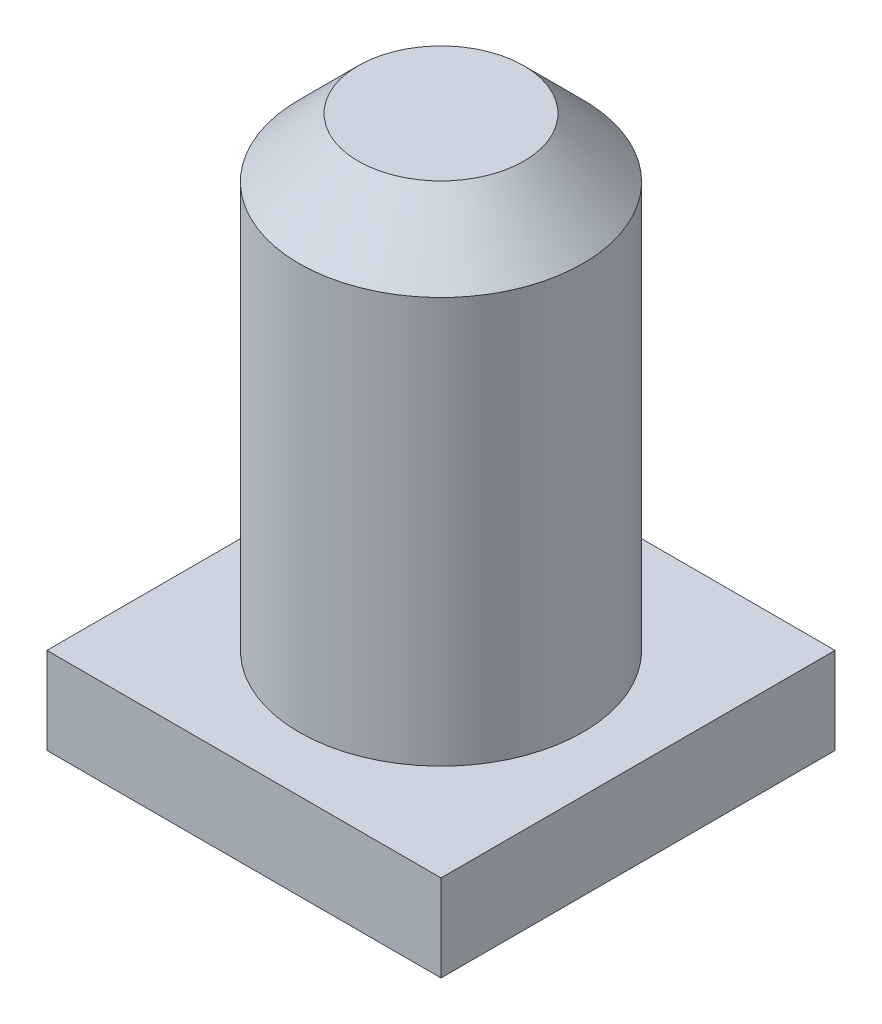
ISO-10303-21;
HEADER;
FILE_DESCRIPTION(('STEP AP214'),'2;1');
FILE_NAME('part.step','',(''),(''),'','','');
FILE_SCHEMA(('AUTOMOTIVE_DESIGN { 1 0 10303 214 1 1 1 1 }'));
ENDSEC;
DATA;
#1=APPLICATION_CONTEXT('core data for automotive mechanical design processes');
#2=APPLICATION_PROTOCOL_DEFINITION('international standard','automotive_design',2000,#1);
#3=PRODUCT_CONTEXT('',#1,'mechanical');
#4=PRODUCT('Part','Part','',(#3));
#5=PRODUCT_RELATED_PRODUCT_CATEGORY('part','',(#4));
#6=PRODUCT_DEFINITION_FORMATION('','',#4);
#7=PRODUCT_DEFINITION_CONTEXT('part definition',#1,'design');
#8=PRODUCT_DEFINITION('design','',#6,#7);
#9=PRODUCT_DEFINITION_SHAPE('','',#8);
#10=(LENGTH_UNIT() NAMED_UNIT(*) SI_UNIT(.MILLI.,.METRE.));
#11=(NAMED_UNIT(*) PLANE_ANGLE_UNIT() SI_UNIT($,.RADIAN.));
#12=(NAMED_UNIT(*) SI_UNIT($,.STERADIAN.) SOLID_ANGLE_UNIT());
#13=UNCERTAINTY_MEASURE_WITH_UNIT(LENGTH_MEASURE(1.E-05),#10,'distance_accuracy_value','');
#14=(GEOMETRIC_REPRESENTATION_CONTEXT(3) GLOBAL_UNCERTAINTY_ASSIGNED_CONTEXT((#13)) GLOBAL_UNIT_ASSIGNED_CONTEXT((#10,
#11,#12)) REPRESENTATION_CONTEXT('',''));
#15=CARTESIAN_POINT('',(0.,0.,0.));
#16=DIRECTION('',(0.,0.,1.));
#17=DIRECTION('',(1.,0.,0.));
#18=AXIS2_PLACEMENT_3D('',#15,#16,#17);
#19=CARTESIAN_POINT('',(0.,7.,0.));
#20=DIRECTION('',(0.,-1.,0.));
#21=DIRECTION('',(0.,0.,-1.));
#22=AXIS2_PLACEMENT_3D('',#19,#20,#21);
#23=CYLINDRICAL_SURFACE('',#22,1.8);
#24=CARTESIAN_POINT('',(0.,6.25,0.));
#25=DIRECTION('',(0.,1.,0.));
#26=DIRECTION('',(0.,0.,1.));
#27=AXIS2_PLACEMENT_3D('',#24,#25,#26);
#28=CIRCLE('',#27,1.8);
#29=CARTESIAN_POINT('',(0.,6.25,1.8));
#30=VERTEX_POINT('',#29);
#31=EDGE_CURVE('E11',#30,#30,#28,.F.);
#32=ORIENTED_EDGE('',*,*,#31,.T.);
#33=EDGE_LOOP('',(#32));
#34=FACE_BOUND('',#33,.T.);
#35=CARTESIAN_POINT('',(0.,1.1,0.));
#36=DIRECTION('',(0.,1.,0.));
#37=DIRECTION('',(0.,0.,1.));
#38=AXIS2_PLACEMENT_3D('',#35,#36,#37);
#39=CIRCLE('',#38,1.8);
#40=CARTESIAN_POINT('',(0.,1.1,1.8));
#41=VERTEX_POINT('',#40);
#42=EDGE_CURVE('E110',#41,#41,#39,.T.);
#43=ORIENTED_EDGE('',*,*,#42,.T.);
#44=EDGE_LOOP('',(#43));
#45=FACE_BOUND('',#44,.T.);
#46=ADVANCED_FACE('F33',(#34,#45),#23,.T.);
#47=CARTESIAN_POINT('',(0.,7.,0.));
#48=DIRECTION('',(0.,1.,0.));
#49=DIRECTION('',(0.,0.,1.));
#50=AXIS2_PLACEMENT_3D('',#47,#48,#49);
#51=PLANE('',#50);
#52=CARTESIAN_POINT('',(0.,7.,0.));
#53=DIRECTION('',(0.,1.,0.));
#54=DIRECTION('',(0.,0.,1.));
#55=AXIS2_PLACEMENT_3D('',#52,#53,#54);
#56=CIRCLE('',#55,1.05);
#57=CARTESIAN_POINT('',(0.,7.,1.05));
#58=VERTEX_POINT('',#57);
#59=EDGE_CURVE('E42',#58,#58,#56,.T.);
#60=ORIENTED_EDGE('',*,*,#59,.T.);
#61=EDGE_LOOP('',(#60));
#62=FACE_BOUND('',#61,.T.);
#63=ADVANCED_FACE('F117',(#62),#51,.T.);
#64=CARTESIAN_POINT('',(2.5,1.1,-2.5));
#65=DIRECTION('',(1.,0.,0.));
#66=DIRECTION('',(0.,0.,-1.));
#67=AXIS2_PLACEMENT_3D('',#64,#65,#66);
#68=PLANE('',#67);
#69=DIRECTION('',(0.,0.,1.));
#70=VECTOR('',#69,1.);
#71=CARTESIAN_POINT('',(2.5,0.,-2.5));
#72=LINE('',#71,#70);
#73=CARTESIAN_POINT('',(2.5,0.,-2.5));
#74=VERTEX_POINT('',#73);
#75=CARTESIAN_POINT('',(2.5,0.,2.5));
#76=VERTEX_POINT('',#75);
#77=EDGE_CURVE('E101',#74,#76,#72,.T.);
#78=ORIENTED_EDGE('',*,*,#77,.F.);
#79=DIRECTION('',(0.,-1.,0.));
#80=VECTOR('',#79,1.);
#81=CARTESIAN_POINT('',(2.5,1.1,-2.5));
#82=LINE('',#81,#80);
#83=CARTESIAN_POINT('',(2.5,1.1,-2.5));
#84=VERTEX_POINT('',#83);
#85=EDGE_CURVE('E50',#84,#74,#82,.T.);
#86=ORIENTED_EDGE('',*,*,#85,.F.);
#87=DIRECTION('',(0.,0.,1.));
#88=VECTOR('',#87,1.);
#89=CARTESIAN_POINT('',(2.5,1.1,-2.5));
#90=LINE('',#89,#88);
#91=CARTESIAN_POINT('',(2.5,1.1,2.5));
#92=VERTEX_POINT('',#91);
#93=EDGE_CURVE('E95',#84,#92,#90,.T.);
#94=ORIENTED_EDGE('',*,*,#93,.T.);
#95=DIRECTION('',(0.,-1.,0.));
#96=VECTOR('',#95,1.);
#97=CARTESIAN_POINT('',(2.5,1.1,2.5));
#98=LINE('',#97,#96);
#99=EDGE_CURVE('E78',#92,#76,#98,.T.);
#100=ORIENTED_EDGE('',*,*,#99,.T.);
#101=EDGE_LOOP('',(#78,#86,#94,#100));
#102=FACE_BOUND('',#101,.T.);
#103=ADVANCED_FACE('F133',(#102),#68,.T.);
#104=CARTESIAN_POINT('',(-2.5,1.1,-2.5));
#105=DIRECTION('',(0.,0.,-1.));
#106=DIRECTION('',(-1.,0.,0.));
#107=AXIS2_PLACEMENT_3D('',#104,#105,#106);
#108=PLANE('',#107);
#109=DIRECTION('',(1.,0.,0.));
#110=VECTOR('',#109,1.);
#111=CARTESIAN_POINT('',(-2.5,0.,-2.5));
#112=LINE('',#111,#110);
#113=CARTESIAN_POINT('',(-2.5,0.,-2.5));
#114=VERTEX_POINT('',#113);
#115=EDGE_CURVE('E97',#114,#74,#112,.T.);
#116=ORIENTED_EDGE('',*,*,#115,.F.);
#117=DIRECTION('',(0.,-1.,0.));
#118=VECTOR('',#117,1.);
#119=CARTESIAN_POINT('',(-2.5,1.1,-2.5));
#120=LINE('',#119,#118);
#121=CARTESIAN_POINT('',(-2.5,1.1,-2.5));
#122=VERTEX_POINT('',#121);
#123=EDGE_CURVE('E67',#122,#114,#120,.T.);
#124=ORIENTED_EDGE('',*,*,#123,.F.);
#125=DIRECTION('',(1.,0.,0.));
#126=VECTOR('',#125,1.);
#127=CARTESIAN_POINT('',(-2.5,1.1,-2.5));
#128=LINE('',#127,#126);
#129=EDGE_CURVE('E92',#122,#84,#128,.T.);
#130=ORIENTED_EDGE('',*,*,#129,.T.);
#131=ORIENTED_EDGE('',*,*,#85,.T.);
#132=EDGE_LOOP('',(#116,#124,#130,#131));
#133=FACE_BOUND('',#132,.T.);
#134=ADVANCED_FACE('F139',(#133),#108,.T.);
#135=CARTESIAN_POINT('',(-2.5,1.1,-2.5));
#136=DIRECTION('',(-1.,0.,0.));
#137=DIRECTION('',(0.,0.,1.));
#138=AXIS2_PLACEMENT_3D('',#135,#136,#137);
#139=PLANE('',#138);
#140=DIRECTION('',(0.,0.,-1.));
#141=VECTOR('',#140,1.);
#142=CARTESIAN_POINT('',(-2.5,0.,-2.5));
#143=LINE('',#142,#141);
#144=CARTESIAN_POINT('',(-2.5,0.,2.5));
#145=VERTEX_POINT('',#144);
#146=EDGE_CURVE('E86',#145,#114,#143,.T.);
#147=ORIENTED_EDGE('',*,*,#146,.F.);
#148=DIRECTION('',(0.,-1.,0.));
#149=VECTOR('',#148,1.);
#150=CARTESIAN_POINT('',(-2.5,1.1,2.5));
#151=LINE('',#150,#149);
#152=CARTESIAN_POINT('',(-2.5,1.1,2.5));
#153=VERTEX_POINT('',#152);
#154=EDGE_CURVE('E81',#153,#145,#151,.T.);
#155=ORIENTED_EDGE('',*,*,#154,.F.);
#156=DIRECTION('',(0.,0.,-1.));
#157=VECTOR('',#156,1.);
#158=CARTESIAN_POINT('',(-2.5,1.1,-2.5));
#159=LINE('',#158,#157);
#160=EDGE_CURVE('E84',#153,#122,#159,.T.);
#161=ORIENTED_EDGE('',*,*,#160,.T.);
#162=ORIENTED_EDGE('',*,*,#123,.T.);
#163=EDGE_LOOP('',(#147,#155,#161,#162));
#164=FACE_BOUND('',#163,.T.);
#165=ADVANCED_FACE('F83',(#164),#139,.T.);
#166=CARTESIAN_POINT('',(-2.5,1.1,2.5));
#167=DIRECTION('',(0.,0.,1.));
#168=DIRECTION('',(1.,0.,0.));
#169=AXIS2_PLACEMENT_3D('',#166,#167,#168);
#170=PLANE('',#169);
#171=DIRECTION('',(-1.,0.,0.));
#172=VECTOR('',#171,1.);
#173=CARTESIAN_POINT('',(-2.5,0.,2.5));
#174=LINE('',#173,#172);
#175=EDGE_CURVE('E104',#76,#145,#174,.T.);
#176=ORIENTED_EDGE('',*,*,#175,.F.);
#177=ORIENTED_EDGE('',*,*,#99,.F.);
#178=DIRECTION('',(-1.,0.,0.));
#179=VECTOR('',#178,1.);
#180=CARTESIAN_POINT('',(-2.5,1.1,2.5));
#181=LINE('',#180,#179);
#182=EDGE_CURVE('E91',#92,#153,#181,.T.);
#183=ORIENTED_EDGE('',*,*,#182,.T.);
#184=ORIENTED_EDGE('',*,*,#154,.T.);
#185=EDGE_LOOP('',(#176,#177,#183,#184));
#186=FACE_BOUND('',#185,.T.);
#187=ADVANCED_FACE('F94',(#186),#170,.T.);
#188=CARTESIAN_POINT('',(0.,1.1,0.));
#189=DIRECTION('',(0.,1.,0.));
#190=DIRECTION('',(0.,0.,1.));
#191=AXIS2_PLACEMENT_3D('',#188,#189,#190);
#192=PLANE('',#191);
#193=ORIENTED_EDGE('',*,*,#42,.F.);
#194=EDGE_LOOP('',(#193));
#195=FACE_BOUND('',#194,.T.);
#196=ORIENTED_EDGE('',*,*,#93,.F.);
#197=ORIENTED_EDGE('',*,*,#129,.F.);
#198=ORIENTED_EDGE('',*,*,#160,.F.);
#199=ORIENTED_EDGE('',*,*,#182,.F.);
#200=EDGE_LOOP('',(#196,#197,#198,#199));
#201=FACE_BOUND('',#200,.T.);
#202=ADVANCED_FACE('F90',(#195,#201),#192,.T.);
#203=CARTESIAN_POINT('',(0.,0.,0.));
#204=DIRECTION('',(0.,1.,0.));
#205=DIRECTION('',(0.,0.,1.));
#206=AXIS2_PLACEMENT_3D('',#203,#204,#205);
#207=PLANE('',#206);
#208=ORIENTED_EDGE('',*,*,#77,.T.);
#209=ORIENTED_EDGE('',*,*,#175,.T.);
#210=ORIENTED_EDGE('',*,*,#146,.T.);
#211=ORIENTED_EDGE('',*,*,#115,.T.);
#212=EDGE_LOOP('',(#208,#209,#210,#211));
#213=FACE_BOUND('',#212,.T.);
#214=ADVANCED_FACE('F120',(#213),#207,.F.);
#215=CARTESIAN_POINT('',(0.,7.,0.));
#216=DIRECTION('',(0.,-1.,0.));
#217=DIRECTION('',(0.,0.,-1.));
#218=AXIS2_PLACEMENT_3D('',#215,#216,#217);
#219=CONICAL_SURFACE('',#218,1.05,0.785398163397447);
#220=ORIENTED_EDGE('',*,*,#31,.F.);
#221=EDGE_LOOP('',(#220));
#222=FACE_BOUND('',#221,.T.);
#223=ORIENTED_EDGE('',*,*,#59,.F.);
#224=EDGE_LOOP('',(#223));
#225=FACE_BOUND('',#224,.T.);
#226=ADVANCED_FACE('F35',(#222,#225),#219,.T.);
#227=CLOSED_SHELL('',(#46,#63,#103,#134,#165,#187,#202,#214,#226));
#228=MANIFOLD_SOLID_BREP('B2',#227);
#229=ADVANCED_BREP_SHAPE_REPRESENTATION('',(#18,#228),#14);
#230=SHAPE_DEFINITION_REPRESENTATION(#9,#229);
ENDSEC;
END-ISO-10303-21;
